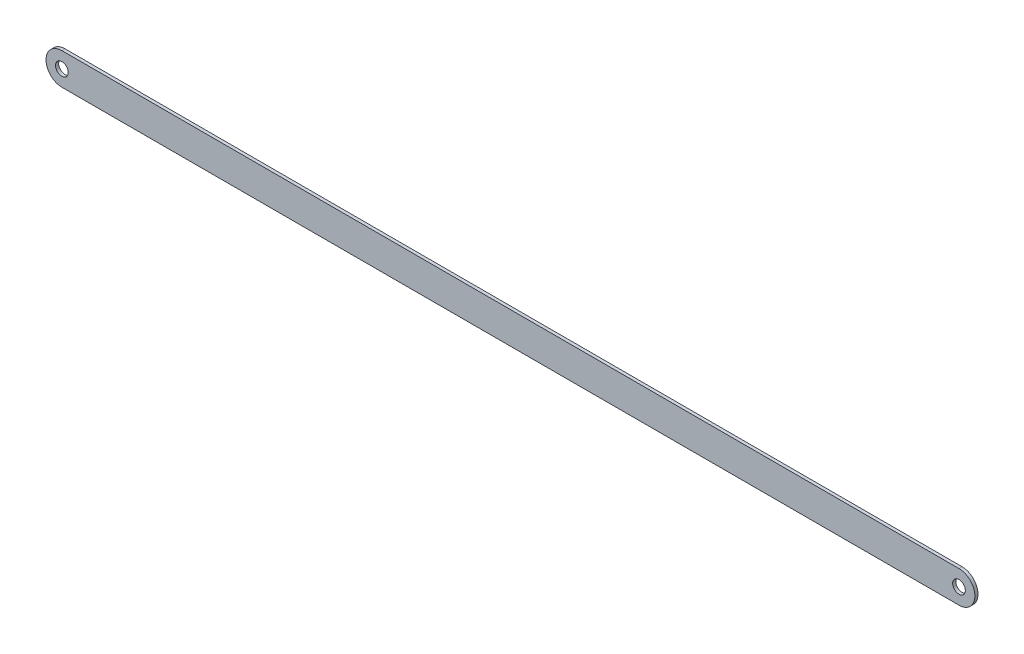
ISO-10303-21;
HEADER;
FILE_DESCRIPTION(('STEP AP214'),'2;1');
FILE_NAME('part.step','',(''),(''),'','','');
FILE_SCHEMA(('AUTOMOTIVE_DESIGN { 1 0 10303 214 1 1 1 1 }'));
ENDSEC;
DATA;
#1=APPLICATION_CONTEXT('core data for automotive mechanical design processes');
#2=APPLICATION_PROTOCOL_DEFINITION('international standard','automotive_design',2000,#1);
#3=PRODUCT_CONTEXT('',#1,'mechanical');
#4=PRODUCT('Part','Part','',(#3));
#5=PRODUCT_RELATED_PRODUCT_CATEGORY('part','',(#4));
#6=PRODUCT_DEFINITION_FORMATION('','',#4);
#7=PRODUCT_DEFINITION_CONTEXT('part definition',#1,'design');
#8=PRODUCT_DEFINITION('design','',#6,#7);
#9=PRODUCT_DEFINITION_SHAPE('','',#8);
#10=(LENGTH_UNIT() NAMED_UNIT(*) SI_UNIT(.MILLI.,.METRE.));
#11=(NAMED_UNIT(*) PLANE_ANGLE_UNIT() SI_UNIT($,.RADIAN.));
#12=(NAMED_UNIT(*) SI_UNIT($,.STERADIAN.) SOLID_ANGLE_UNIT());
#13=UNCERTAINTY_MEASURE_WITH_UNIT(LENGTH_MEASURE(1.E-05),#10,'distance_accuracy_value','');
#14=(GEOMETRIC_REPRESENTATION_CONTEXT(3) GLOBAL_UNCERTAINTY_ASSIGNED_CONTEXT((#13)) GLOBAL_UNIT_ASSIGNED_CONTEXT((#10,
#11,#12)) REPRESENTATION_CONTEXT('',''));
#15=CARTESIAN_POINT('',(0.,0.,0.));
#16=DIRECTION('',(0.,0.,1.));
#17=DIRECTION('',(1.,0.,0.));
#18=AXIS2_PLACEMENT_3D('',#15,#16,#17);
#19=CARTESIAN_POINT('',(0.,5.08,0.5));
#20=DIRECTION('',(0.,0.,-1.));
#21=DIRECTION('',(-1.,0.,0.));
#22=AXIS2_PLACEMENT_3D('',#19,#20,#21);
#23=CYLINDRICAL_SURFACE('',#22,5.08000000000002);
#24=CARTESIAN_POINT('',(0.,5.08,-0.5));
#25=DIRECTION('',(0.,0.,1.));
#26=DIRECTION('',(1.,0.,0.));
#27=AXIS2_PLACEMENT_3D('',#24,#25,#26);
#28=CIRCLE('',#27,5.08000000000002);
#29=CARTESIAN_POINT('',(0.,10.16,-0.5));
#30=VERTEX_POINT('',#29);
#31=CARTESIAN_POINT('',(0.,0.,-0.5));
#32=VERTEX_POINT('',#31);
#33=EDGE_CURVE('E110',#30,#32,#28,.T.);
#34=ORIENTED_EDGE('',*,*,#33,.T.);
#35=DIRECTION('',(0.,0.,-1.));
#36=VECTOR('',#35,1.);
#37=CARTESIAN_POINT('',(0.,0.,0.5));
#38=LINE('',#37,#36);
#39=CARTESIAN_POINT('',(0.,0.,0.5));
#40=VERTEX_POINT('',#39);
#41=EDGE_CURVE('E11',#40,#32,#38,.T.);
#42=ORIENTED_EDGE('',*,*,#41,.F.);
#43=CARTESIAN_POINT('',(0.,5.08,0.5));
#44=DIRECTION('',(0.,0.,1.));
#45=DIRECTION('',(1.,0.,0.));
#46=AXIS2_PLACEMENT_3D('',#43,#44,#45);
#47=CIRCLE('',#46,5.08000000000002);
#48=CARTESIAN_POINT('',(0.,10.16,0.5));
#49=VERTEX_POINT('',#48);
#50=EDGE_CURVE('E93',#49,#40,#47,.T.);
#51=ORIENTED_EDGE('',*,*,#50,.F.);
#52=DIRECTION('',(0.,0.,-1.));
#53=VECTOR('',#52,1.);
#54=CARTESIAN_POINT('',(0.,10.16,0.5));
#55=LINE('',#54,#53);
#56=EDGE_CURVE('E106',#49,#30,#55,.T.);
#57=ORIENTED_EDGE('',*,*,#56,.T.);
#58=EDGE_LOOP('',(#34,#42,#51,#57));
#59=FACE_BOUND('',#58,.T.);
#60=ADVANCED_FACE('F39',(#59),#23,.T.);
#61=CARTESIAN_POINT('',(0.,0.,0.5));
#62=DIRECTION('',(0.,1.,0.));
#63=DIRECTION('',(-1.,0.,0.));
#64=AXIS2_PLACEMENT_3D('',#61,#62,#63);
#65=PLANE('',#64);
#66=DIRECTION('',(1.,0.,0.));
#67=VECTOR('',#66,1.);
#68=CARTESIAN_POINT('',(0.,0.,-0.5));
#69=LINE('',#68,#67);
#70=CARTESIAN_POINT('',(287.02,0.,-0.5));
#71=VERTEX_POINT('',#70);
#72=EDGE_CURVE('E98',#32,#71,#69,.T.);
#73=ORIENTED_EDGE('',*,*,#72,.T.);
#74=DIRECTION('',(0.,0.,-1.));
#75=VECTOR('',#74,1.);
#76=CARTESIAN_POINT('',(287.02,0.,0.5));
#77=LINE('',#76,#75);
#78=CARTESIAN_POINT('',(287.02,0.,0.5));
#79=VERTEX_POINT('',#78);
#80=EDGE_CURVE('E49',#79,#71,#77,.T.);
#81=ORIENTED_EDGE('',*,*,#80,.F.);
#82=DIRECTION('',(1.,0.,0.));
#83=VECTOR('',#82,1.);
#84=CARTESIAN_POINT('',(0.,0.,0.5));
#85=LINE('',#84,#83);
#86=EDGE_CURVE('E88',#40,#79,#85,.T.);
#87=ORIENTED_EDGE('',*,*,#86,.F.);
#88=ORIENTED_EDGE('',*,*,#41,.T.);
#89=EDGE_LOOP('',(#73,#81,#87,#88));
#90=FACE_BOUND('',#89,.T.);
#91=ADVANCED_FACE('F97',(#90),#65,.F.);
#92=CARTESIAN_POINT('',(287.02,5.08000000000007,0.5));
#93=DIRECTION('',(0.,0.,-1.));
#94=DIRECTION('',(-1.,0.,0.));
#95=AXIS2_PLACEMENT_3D('',#92,#93,#94);
#96=CYLINDRICAL_SURFACE('',#95,5.08);
#97=CARTESIAN_POINT('',(287.02,5.08000000000007,-0.5));
#98=DIRECTION('',(0.,0.,1.));
#99=DIRECTION('',(1.,0.,0.));
#100=AXIS2_PLACEMENT_3D('',#97,#98,#99);
#101=CIRCLE('',#100,5.08);
#102=CARTESIAN_POINT('',(287.02,10.1600000000001,-0.5));
#103=VERTEX_POINT('',#102);
#104=EDGE_CURVE('E75',#71,#103,#101,.T.);
#105=ORIENTED_EDGE('',*,*,#104,.T.);
#106=DIRECTION('',(0.,0.,-1.));
#107=VECTOR('',#106,1.);
#108=CARTESIAN_POINT('',(287.02,10.1600000000001,0.5));
#109=LINE('',#108,#107);
#110=CARTESIAN_POINT('',(287.02,10.1600000000001,0.5));
#111=VERTEX_POINT('',#110);
#112=EDGE_CURVE('E100',#111,#103,#109,.T.);
#113=ORIENTED_EDGE('',*,*,#112,.F.);
#114=CARTESIAN_POINT('',(287.02,5.08000000000007,0.5));
#115=DIRECTION('',(0.,0.,1.));
#116=DIRECTION('',(1.,0.,0.));
#117=AXIS2_PLACEMENT_3D('',#114,#115,#116);
#118=CIRCLE('',#117,5.08);
#119=EDGE_CURVE('E91',#79,#111,#118,.T.);
#120=ORIENTED_EDGE('',*,*,#119,.F.);
#121=ORIENTED_EDGE('',*,*,#80,.T.);
#122=EDGE_LOOP('',(#105,#113,#120,#121));
#123=FACE_BOUND('',#122,.T.);
#124=ADVANCED_FACE('F102',(#123),#96,.T.);
#125=CARTESIAN_POINT('',(287.02,10.1600000000001,0.5));
#126=DIRECTION('',(0.,-1.,0.));
#127=DIRECTION('',(1.,0.,0.));
#128=AXIS2_PLACEMENT_3D('',#125,#126,#127);
#129=PLANE('',#128);
#130=DIRECTION('',(-1.,0.,0.));
#131=VECTOR('',#130,1.);
#132=CARTESIAN_POINT('',(287.02,10.1600000000001,-0.5));
#133=LINE('',#132,#131);
#134=EDGE_CURVE('E81',#103,#30,#133,.T.);
#135=ORIENTED_EDGE('',*,*,#134,.T.);
#136=ORIENTED_EDGE('',*,*,#56,.F.);
#137=DIRECTION('',(-1.,0.,0.));
#138=VECTOR('',#137,1.);
#139=CARTESIAN_POINT('',(287.02,10.1600000000001,0.5));
#140=LINE('',#139,#138);
#141=EDGE_CURVE('E58',#111,#49,#140,.T.);
#142=ORIENTED_EDGE('',*,*,#141,.F.);
#143=ORIENTED_EDGE('',*,*,#112,.T.);
#144=EDGE_LOOP('',(#135,#136,#142,#143));
#145=FACE_BOUND('',#144,.T.);
#146=ADVANCED_FACE('F148',(#145),#129,.F.);
#147=CARTESIAN_POINT('',(0.,5.08,0.5));
#148=DIRECTION('',(0.,0.,1.));
#149=DIRECTION('',(1.,0.,0.));
#150=AXIS2_PLACEMENT_3D('',#147,#148,#149);
#151=PLANE('',#150);
#152=CARTESIAN_POINT('',(0.,5.08,0.5));
#153=DIRECTION('',(0.,0.,1.));
#154=DIRECTION('',(1.,0.,0.));
#155=AXIS2_PLACEMENT_3D('',#152,#153,#154);
#156=CIRCLE('',#155,2.032);
#157=CARTESIAN_POINT('',(2.032,5.08,0.5));
#158=VERTEX_POINT('',#157);
#159=EDGE_CURVE('E126',#158,#158,#156,.T.);
#160=ORIENTED_EDGE('',*,*,#159,.F.);
#161=EDGE_LOOP('',(#160));
#162=FACE_BOUND('',#161,.T.);
#163=CARTESIAN_POINT('',(287.02,5.08000000000007,0.5));
#164=DIRECTION('',(0.,0.,1.));
#165=DIRECTION('',(1.,0.,0.));
#166=AXIS2_PLACEMENT_3D('',#163,#164,#165);
#167=CIRCLE('',#166,2.02672514827627);
#168=CARTESIAN_POINT('',(289.046725148276,5.08000000000007,0.5));
#169=VERTEX_POINT('',#168);
#170=EDGE_CURVE('E133',#169,#169,#167,.T.);
#171=ORIENTED_EDGE('',*,*,#170,.F.);
#172=EDGE_LOOP('',(#171));
#173=FACE_BOUND('',#172,.T.);
#174=ORIENTED_EDGE('',*,*,#50,.T.);
#175=ORIENTED_EDGE('',*,*,#86,.T.);
#176=ORIENTED_EDGE('',*,*,#119,.T.);
#177=ORIENTED_EDGE('',*,*,#141,.T.);
#178=EDGE_LOOP('',(#174,#175,#176,#177));
#179=FACE_BOUND('',#178,.T.);
#180=ADVANCED_FACE('F89',(#162,#173,#179),#151,.T.);
#181=CARTESIAN_POINT('',(0.,5.08,-0.5));
#182=DIRECTION('',(0.,0.,1.));
#183=DIRECTION('',(1.,0.,0.));
#184=AXIS2_PLACEMENT_3D('',#181,#182,#183);
#185=PLANE('',#184);
#186=CARTESIAN_POINT('',(0.,5.08,-0.5));
#187=DIRECTION('',(0.,0.,1.));
#188=DIRECTION('',(1.,0.,0.));
#189=AXIS2_PLACEMENT_3D('',#186,#187,#188);
#190=CIRCLE('',#189,2.032);
#191=CARTESIAN_POINT('',(2.032,5.08,-0.5));
#192=VERTEX_POINT('',#191);
#193=EDGE_CURVE('E42',#192,#192,#190,.T.);
#194=ORIENTED_EDGE('',*,*,#193,.T.);
#195=EDGE_LOOP('',(#194));
#196=FACE_BOUND('',#195,.T.);
#197=CARTESIAN_POINT('',(287.02,5.08000000000007,-0.5));
#198=DIRECTION('',(0.,0.,1.));
#199=DIRECTION('',(1.,0.,0.));
#200=AXIS2_PLACEMENT_3D('',#197,#198,#199);
#201=CIRCLE('',#200,2.02672514827627);
#202=CARTESIAN_POINT('',(289.046725148276,5.08000000000007,-0.5));
#203=VERTEX_POINT('',#202);
#204=EDGE_CURVE('E123',#203,#203,#201,.T.);
#205=ORIENTED_EDGE('',*,*,#204,.T.);
#206=EDGE_LOOP('',(#205));
#207=FACE_BOUND('',#206,.T.);
#208=ORIENTED_EDGE('',*,*,#33,.F.);
#209=ORIENTED_EDGE('',*,*,#134,.F.);
#210=ORIENTED_EDGE('',*,*,#104,.F.);
#211=ORIENTED_EDGE('',*,*,#72,.F.);
#212=EDGE_LOOP('',(#208,#209,#210,#211));
#213=FACE_BOUND('',#212,.T.);
#214=ADVANCED_FACE('F147',(#196,#207,#213),#185,.F.);
#215=CARTESIAN_POINT('',(287.02,5.08000000000007,-2.04));
#216=DIRECTION('',(0.,0.,1.));
#217=DIRECTION('',(1.,0.,0.));
#218=AXIS2_PLACEMENT_3D('',#215,#216,#217);
#219=CYLINDRICAL_SURFACE('',#218,2.02672514827627);
#220=ORIENTED_EDGE('',*,*,#170,.T.);
#221=EDGE_LOOP('',(#220));
#222=FACE_BOUND('',#221,.T.);
#223=ORIENTED_EDGE('',*,*,#204,.F.);
#224=EDGE_LOOP('',(#223));
#225=FACE_BOUND('',#224,.T.);
#226=ADVANCED_FACE('F143',(#222,#225),#219,.F.);
#227=CARTESIAN_POINT('',(0.,5.08,-2.04));
#228=DIRECTION('',(0.,0.,1.));
#229=DIRECTION('',(1.,0.,0.));
#230=AXIS2_PLACEMENT_3D('',#227,#228,#229);
#231=CYLINDRICAL_SURFACE('',#230,2.032);
#232=ORIENTED_EDGE('',*,*,#159,.T.);
#233=EDGE_LOOP('',(#232));
#234=FACE_BOUND('',#233,.T.);
#235=ORIENTED_EDGE('',*,*,#193,.F.);
#236=EDGE_LOOP('',(#235));
#237=FACE_BOUND('',#236,.T.);
#238=ADVANCED_FACE('F195',(#234,#237),#231,.F.);
#239=CLOSED_SHELL('',(#60,#91,#124,#146,#180,#214,#226,#238));
#240=MANIFOLD_SOLID_BREP('B2',#239);
#241=ADVANCED_BREP_SHAPE_REPRESENTATION('',(#18,#240),#14);
#242=SHAPE_DEFINITION_REPRESENTATION(#9,#241);
ENDSEC;
END-ISO-10303-21;
